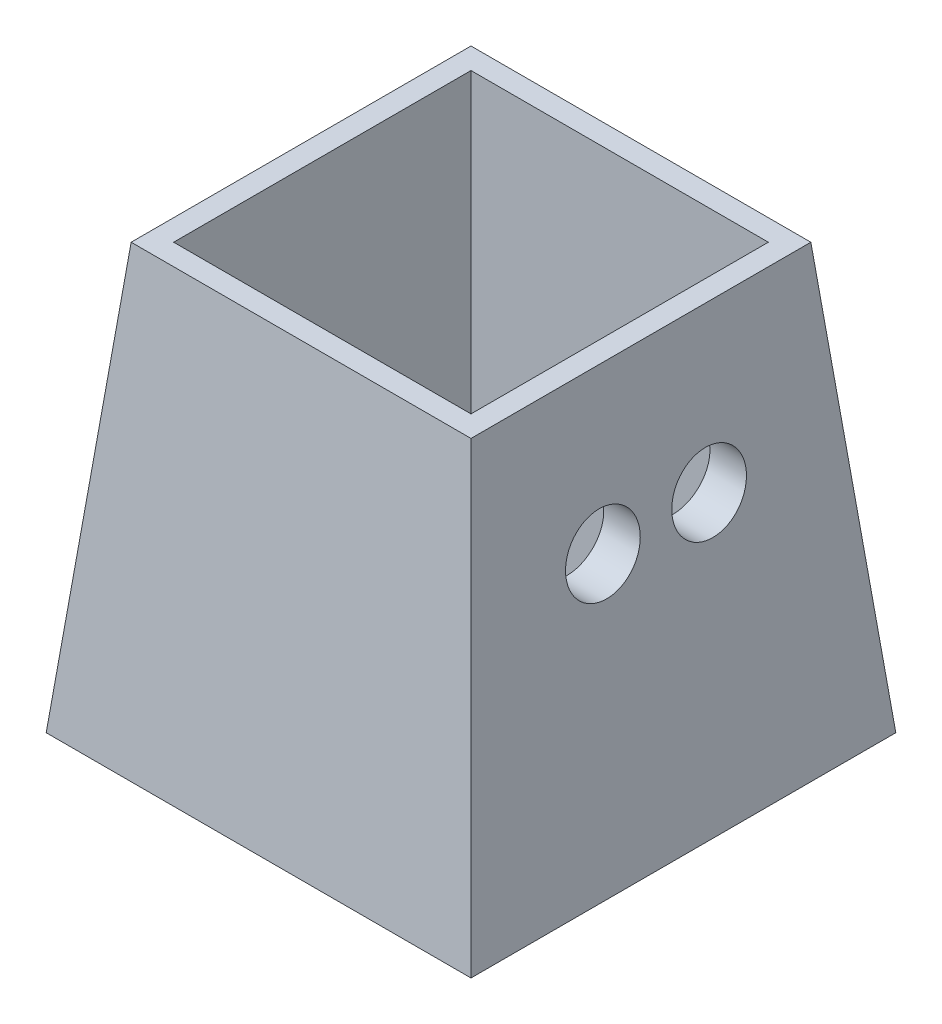
ISO-10303-21;
HEADER;
FILE_DESCRIPTION(('STEP AP214'),'2;1');
FILE_NAME('part.step','',(''),(''),'','','');
FILE_SCHEMA(('AUTOMOTIVE_DESIGN { 1 0 10303 214 1 1 1 1 }'));
ENDSEC;
DATA;
#1=APPLICATION_CONTEXT('core data for automotive mechanical design processes');
#2=APPLICATION_PROTOCOL_DEFINITION('international standard','automotive_design',2000,#1);
#3=PRODUCT_CONTEXT('',#1,'mechanical');
#4=PRODUCT('Part','Part','',(#3));
#5=PRODUCT_RELATED_PRODUCT_CATEGORY('part','',(#4));
#6=PRODUCT_DEFINITION_FORMATION('','',#4);
#7=PRODUCT_DEFINITION_CONTEXT('part definition',#1,'design');
#8=PRODUCT_DEFINITION('design','',#6,#7);
#9=PRODUCT_DEFINITION_SHAPE('','',#8);
#10=(LENGTH_UNIT() NAMED_UNIT(*) SI_UNIT(.MILLI.,.METRE.));
#11=(NAMED_UNIT(*) PLANE_ANGLE_UNIT() SI_UNIT($,.RADIAN.));
#12=(NAMED_UNIT(*) SI_UNIT($,.STERADIAN.) SOLID_ANGLE_UNIT());
#13=UNCERTAINTY_MEASURE_WITH_UNIT(LENGTH_MEASURE(1.E-05),#10,'distance_accuracy_value','');
#14=(GEOMETRIC_REPRESENTATION_CONTEXT(3) GLOBAL_UNCERTAINTY_ASSIGNED_CONTEXT((#13)) GLOBAL_UNIT_ASSIGNED_CONTEXT((#10,
#11,#12)) REPRESENTATION_CONTEXT('',''));
#15=CARTESIAN_POINT('',(0.,0.,0.));
#16=DIRECTION('',(0.,0.,1.));
#17=DIRECTION('',(1.,0.,0.));
#18=AXIS2_PLACEMENT_3D('',#15,#16,#17);
#19=CARTESIAN_POINT('',(-35.,0.,10.));
#20=DIRECTION('',(0.,0.,-1.));
#21=DIRECTION('',(-1.,0.,0.));
#22=AXIS2_PLACEMENT_3D('',#19,#20,#21);
#23=PLANE('',#22);
#24=DIRECTION('',(1.,0.,0.));
#25=VECTOR('',#24,1.);
#26=CARTESIAN_POINT('',(35.,10.,9.99999999999999));
#27=LINE('',#26,#25);
#28=CARTESIAN_POINT('',(-35.,10.,9.99999999999999));
#29=VERTEX_POINT('',#28);
#30=CARTESIAN_POINT('',(35.,10.,9.99999999999999));
#31=VERTEX_POINT('',#30);
#32=EDGE_CURVE('E145',#29,#31,#27,.T.);
#33=ORIENTED_EDGE('',*,*,#32,.F.);
#34=DIRECTION('',(0.,1.,0.));
#35=VECTOR('',#34,1.);
#36=CARTESIAN_POINT('',(-35.,0.,10.));
#37=LINE('',#36,#35);
#38=CARTESIAN_POINT('',(-35.,0.,10.));
#39=VERTEX_POINT('',#38);
#40=EDGE_CURVE('E143',#39,#29,#37,.T.);
#41=ORIENTED_EDGE('',*,*,#40,.F.);
#42=DIRECTION('',(-1.,0.,0.));
#43=VECTOR('',#42,1.);
#44=CARTESIAN_POINT('',(-35.,0.,10.));
#45=LINE('',#44,#43);
#46=CARTESIAN_POINT('',(35.,0.,9.99999999999999));
#47=VERTEX_POINT('',#46);
#48=EDGE_CURVE('E174',#47,#39,#45,.T.);
#49=ORIENTED_EDGE('',*,*,#48,.F.);
#50=DIRECTION('',(0.,1.,0.));
#51=VECTOR('',#50,1.);
#52=CARTESIAN_POINT('',(35.,0.,9.99999999999999));
#53=LINE('',#52,#51);
#54=EDGE_CURVE('E187',#47,#31,#53,.T.);
#55=ORIENTED_EDGE('',*,*,#54,.T.);
#56=EDGE_LOOP('',(#33,#41,#49,#55));
#57=FACE_BOUND('',#56,.T.);
#58=ADVANCED_FACE('F45',(#57),#23,.F.);
#59=CARTESIAN_POINT('',(-35.,0.,-9.99999999999999));
#60=DIRECTION('',(0.,0.,1.));
#61=DIRECTION('',(1.,0.,0.));
#62=AXIS2_PLACEMENT_3D('',#59,#60,#61);
#63=PLANE('',#62);
#64=DIRECTION('',(-1.,0.,0.));
#65=VECTOR('',#64,1.);
#66=CARTESIAN_POINT('',(35.,10.,-9.99999999999999));
#67=LINE('',#66,#65);
#68=CARTESIAN_POINT('',(35.,10.,-9.99999999999999));
#69=VERTEX_POINT('',#68);
#70=CARTESIAN_POINT('',(-35.,10.,-9.99999999999999));
#71=VERTEX_POINT('',#70);
#72=EDGE_CURVE('E146',#69,#71,#67,.T.);
#73=ORIENTED_EDGE('',*,*,#72,.F.);
#74=DIRECTION('',(0.,1.,0.));
#75=VECTOR('',#74,1.);
#76=CARTESIAN_POINT('',(35.,0.,-9.99999999999999));
#77=LINE('',#76,#75);
#78=CARTESIAN_POINT('',(35.,0.,-9.99999999999999));
#79=VERTEX_POINT('',#78);
#80=EDGE_CURVE('E157',#79,#69,#77,.T.);
#81=ORIENTED_EDGE('',*,*,#80,.F.);
#82=DIRECTION('',(1.,0.,0.));
#83=VECTOR('',#82,1.);
#84=CARTESIAN_POINT('',(-35.,0.,-9.99999999999999));
#85=LINE('',#84,#83);
#86=CARTESIAN_POINT('',(-35.,0.,-9.99999999999999));
#87=VERTEX_POINT('',#86);
#88=EDGE_CURVE('E155',#87,#79,#85,.T.);
#89=ORIENTED_EDGE('',*,*,#88,.F.);
#90=DIRECTION('',(0.,1.,0.));
#91=VECTOR('',#90,1.);
#92=CARTESIAN_POINT('',(-35.,0.,-9.99999999999999));
#93=LINE('',#92,#91);
#94=EDGE_CURVE('E140',#87,#71,#93,.T.);
#95=ORIENTED_EDGE('',*,*,#94,.T.);
#96=EDGE_LOOP('',(#73,#81,#89,#95));
#97=FACE_BOUND('',#96,.T.);
#98=ADVANCED_FACE('F153',(#97),#63,.F.);
#99=CARTESIAN_POINT('',(50.,0.,50.));
#100=DIRECTION('',(0.995037190209989,0.0995037190209989,0.));
#101=DIRECTION('',(0.,0.,-1.));
#102=AXIS2_PLACEMENT_3D('',#99,#100,#101);
#103=PLANE('',#102);
#104=CARTESIAN_POINT('',(43.55,64.5,12.5));
#105=DIRECTION('',(0.995037190209989,0.0995037190209989,0.));
#106=DIRECTION('',(-0.0995037190209989,0.995037190209989,0.));
#107=AXIS2_PLACEMENT_3D('',#104,#105,#106);
#108=ELLIPSE('',#107,8.79364116848078,8.75000000000001);
#109=CARTESIAN_POINT('',(42.675,73.25,12.5));
#110=VERTEX_POINT('',#109);
#111=EDGE_CURVE('E321',#110,#110,#108,.T.);
#112=ORIENTED_EDGE('',*,*,#111,.F.);
#113=EDGE_LOOP('',(#112));
#114=FACE_BOUND('',#113,.T.);
#115=CARTESIAN_POINT('',(43.55,64.5,-12.5));
#116=DIRECTION('',(0.995037190209989,0.0995037190209989,0.));
#117=DIRECTION('',(-0.0995037190209989,0.995037190209989,0.));
#118=AXIS2_PLACEMENT_3D('',#115,#116,#117);
#119=ELLIPSE('',#118,8.79364116848078,8.75);
#120=CARTESIAN_POINT('',(42.675,73.25,-12.5));
#121=VERTEX_POINT('',#120);
#122=EDGE_CURVE('E325',#121,#121,#119,.T.);
#123=ORIENTED_EDGE('',*,*,#122,.F.);
#124=EDGE_LOOP('',(#123));
#125=FACE_BOUND('',#124,.T.);
#126=DIRECTION('',(-0.0990147542976674,0.990147542976675,-0.0990147542976674));
#127=VECTOR('',#126,1.);
#128=CARTESIAN_POINT('',(50.,0.,50.));
#129=LINE('',#128,#127);
#130=CARTESIAN_POINT('',(50.,0.,50.));
#131=VERTEX_POINT('',#130);
#132=CARTESIAN_POINT('',(40.,100.,40.));
#133=VERTEX_POINT('',#132);
#134=EDGE_CURVE('E13',#131,#133,#129,.T.);
#135=ORIENTED_EDGE('',*,*,#134,.F.);
#136=DIRECTION('',(0.,0.,-1.));
#137=VECTOR('',#136,1.);
#138=CARTESIAN_POINT('',(50.,0.,50.));
#139=LINE('',#138,#137);
#140=CARTESIAN_POINT('',(50.,0.,-50.));
#141=VERTEX_POINT('',#140);
#142=EDGE_CURVE('E199',#131,#141,#139,.T.);
#143=ORIENTED_EDGE('',*,*,#142,.T.);
#144=DIRECTION('',(-0.0990147542976674,0.990147542976674,0.0990147542976674));
#145=VECTOR('',#144,1.);
#146=CARTESIAN_POINT('',(49.0196078431373,9.80392156862746,-49.0196078431373));
#147=LINE('',#146,#145);
#148=CARTESIAN_POINT('',(40.,100.,-40.));
#149=VERTEX_POINT('',#148);
#150=EDGE_CURVE('E54',#141,#149,#147,.T.);
#151=ORIENTED_EDGE('',*,*,#150,.T.);
#152=DIRECTION('',(0.,0.,-1.));
#153=VECTOR('',#152,1.);
#154=CARTESIAN_POINT('',(40.,100.,-40.));
#155=LINE('',#154,#153);
#156=EDGE_CURVE('E205',#133,#149,#155,.T.);
#157=ORIENTED_EDGE('',*,*,#156,.F.);
#158=EDGE_LOOP('',(#135,#143,#151,#157));
#159=FACE_BOUND('',#158,.T.);
#160=ADVANCED_FACE('F48',(#114,#125,#159),#103,.T.);
#161=CARTESIAN_POINT('',(50.,0.,-50.));
#162=DIRECTION('',(0.,0.0995037190209989,-0.995037190209989));
#163=DIRECTION('',(-1.,0.,0.));
#164=AXIS2_PLACEMENT_3D('',#161,#162,#163);
#165=PLANE('',#164);
#166=ORIENTED_EDGE('',*,*,#150,.F.);
#167=DIRECTION('',(-1.,0.,0.));
#168=VECTOR('',#167,1.);
#169=CARTESIAN_POINT('',(50.,0.,-50.));
#170=LINE('',#169,#168);
#171=CARTESIAN_POINT('',(-50.,0.,-50.));
#172=VERTEX_POINT('',#171);
#173=EDGE_CURVE('E202',#141,#172,#170,.T.);
#174=ORIENTED_EDGE('',*,*,#173,.T.);
#175=DIRECTION('',(0.0990147542976674,0.990147542976675,0.0990147542976674));
#176=VECTOR('',#175,1.);
#177=CARTESIAN_POINT('',(-49.0196078431373,9.80392156862746,-49.0196078431373));
#178=LINE('',#177,#176);
#179=CARTESIAN_POINT('',(-40.,100.,-40.));
#180=VERTEX_POINT('',#179);
#181=EDGE_CURVE('E219',#172,#180,#178,.T.);
#182=ORIENTED_EDGE('',*,*,#181,.T.);
#183=DIRECTION('',(-1.,0.,0.));
#184=VECTOR('',#183,1.);
#185=CARTESIAN_POINT('',(-40.,100.,-40.));
#186=LINE('',#185,#184);
#187=EDGE_CURVE('E208',#149,#180,#186,.T.);
#188=ORIENTED_EDGE('',*,*,#187,.F.);
#189=EDGE_LOOP('',(#166,#174,#182,#188));
#190=FACE_BOUND('',#189,.T.);
#191=ADVANCED_FACE('F226',(#190),#165,.T.);
#192=CARTESIAN_POINT('',(-50.,0.,50.));
#193=DIRECTION('',(-0.995037190209989,0.0995037190209989,0.));
#194=DIRECTION('',(0.,0.,1.));
#195=AXIS2_PLACEMENT_3D('',#192,#193,#194);
#196=PLANE('',#195);
#197=ORIENTED_EDGE('',*,*,#181,.F.);
#198=DIRECTION('',(0.,0.,1.));
#199=VECTOR('',#198,1.);
#200=CARTESIAN_POINT('',(-50.,0.,50.));
#201=LINE('',#200,#199);
#202=CARTESIAN_POINT('',(-50.,0.,50.));
#203=VERTEX_POINT('',#202);
#204=EDGE_CURVE('E192',#172,#203,#201,.T.);
#205=ORIENTED_EDGE('',*,*,#204,.T.);
#206=DIRECTION('',(0.0990147542976674,0.990147542976674,-0.0990147542976674));
#207=VECTOR('',#206,1.);
#208=CARTESIAN_POINT('',(-50.,0.,50.));
#209=LINE('',#208,#207);
#210=CARTESIAN_POINT('',(-40.,100.,40.));
#211=VERTEX_POINT('',#210);
#212=EDGE_CURVE('E217',#203,#211,#209,.T.);
#213=ORIENTED_EDGE('',*,*,#212,.T.);
#214=DIRECTION('',(0.,0.,1.));
#215=VECTOR('',#214,1.);
#216=CARTESIAN_POINT('',(-40.,100.,40.));
#217=LINE('',#216,#215);
#218=EDGE_CURVE('E211',#180,#211,#217,.T.);
#219=ORIENTED_EDGE('',*,*,#218,.F.);
#220=EDGE_LOOP('',(#197,#205,#213,#219));
#221=FACE_BOUND('',#220,.T.);
#222=ADVANCED_FACE('F238',(#221),#196,.T.);
#223=CARTESIAN_POINT('',(50.,0.,50.));
#224=DIRECTION('',(0.,0.0995037190209989,0.995037190209989));
#225=DIRECTION('',(1.,0.,0.));
#226=AXIS2_PLACEMENT_3D('',#223,#224,#225);
#227=PLANE('',#226);
#228=DIRECTION('',(1.,0.,0.));
#229=VECTOR('',#228,1.);
#230=CARTESIAN_POINT('',(50.,0.,50.));
#231=LINE('',#230,#229);
#232=EDGE_CURVE('E195',#203,#131,#231,.T.);
#233=ORIENTED_EDGE('',*,*,#232,.T.);
#234=ORIENTED_EDGE('',*,*,#134,.T.);
#235=DIRECTION('',(1.,0.,0.));
#236=VECTOR('',#235,1.);
#237=CARTESIAN_POINT('',(40.,100.,40.));
#238=LINE('',#237,#236);
#239=EDGE_CURVE('E214',#211,#133,#238,.T.);
#240=ORIENTED_EDGE('',*,*,#239,.F.);
#241=ORIENTED_EDGE('',*,*,#212,.F.);
#242=EDGE_LOOP('',(#233,#234,#240,#241));
#243=FACE_BOUND('',#242,.T.);
#244=ADVANCED_FACE('F232',(#243),#227,.T.);
#245=CARTESIAN_POINT('',(0.,100.,0.));
#246=DIRECTION('',(0.,1.,0.));
#247=DIRECTION('',(0.,0.,1.));
#248=AXIS2_PLACEMENT_3D('',#245,#246,#247);
#249=PLANE('',#248);
#250=DIRECTION('',(0.,0.,-1.));
#251=VECTOR('',#250,1.);
#252=CARTESIAN_POINT('',(35.,100.,-35.));
#253=LINE('',#252,#251);
#254=CARTESIAN_POINT('',(35.,100.,35.));
#255=VERTEX_POINT('',#254);
#256=CARTESIAN_POINT('',(35.,100.,-35.));
#257=VERTEX_POINT('',#256);
#258=EDGE_CURVE('E69',#255,#257,#253,.T.);
#259=ORIENTED_EDGE('',*,*,#258,.F.);
#260=DIRECTION('',(1.,0.,0.));
#261=VECTOR('',#260,1.);
#262=CARTESIAN_POINT('',(-35.,100.,35.));
#263=LINE('',#262,#261);
#264=CARTESIAN_POINT('',(-35.,100.,35.));
#265=VERTEX_POINT('',#264);
#266=EDGE_CURVE('E171',#265,#255,#263,.T.);
#267=ORIENTED_EDGE('',*,*,#266,.F.);
#268=DIRECTION('',(0.,0.,1.));
#269=VECTOR('',#268,1.);
#270=CARTESIAN_POINT('',(-35.,100.,-35.));
#271=LINE('',#270,#269);
#272=CARTESIAN_POINT('',(-35.,100.,-35.));
#273=VERTEX_POINT('',#272);
#274=EDGE_CURVE('E185',#273,#265,#271,.T.);
#275=ORIENTED_EDGE('',*,*,#274,.F.);
#276=DIRECTION('',(-1.,0.,0.));
#277=VECTOR('',#276,1.);
#278=CARTESIAN_POINT('',(-35.,100.,-35.));
#279=LINE('',#278,#277);
#280=EDGE_CURVE('E289',#257,#273,#279,.T.);
#281=ORIENTED_EDGE('',*,*,#280,.F.);
#282=EDGE_LOOP('',(#259,#267,#275,#281));
#283=FACE_BOUND('',#282,.T.);
#284=ORIENTED_EDGE('',*,*,#218,.T.);
#285=ORIENTED_EDGE('',*,*,#239,.T.);
#286=ORIENTED_EDGE('',*,*,#156,.T.);
#287=ORIENTED_EDGE('',*,*,#187,.T.);
#288=EDGE_LOOP('',(#284,#285,#286,#287));
#289=FACE_BOUND('',#288,.T.);
#290=ADVANCED_FACE('F229',(#283,#289),#249,.T.);
#291=CARTESIAN_POINT('',(0.,0.,0.));
#292=DIRECTION('',(0.,1.,0.));
#293=DIRECTION('',(0.,0.,1.));
#294=AXIS2_PLACEMENT_3D('',#291,#292,#293);
#295=PLANE('',#294);
#296=DIRECTION('',(-1.,0.,0.));
#297=VECTOR('',#296,1.);
#298=CARTESIAN_POINT('',(-35.,0.,-35.));
#299=LINE('',#298,#297);
#300=CARTESIAN_POINT('',(35.,0.,-35.));
#301=VERTEX_POINT('',#300);
#302=CARTESIAN_POINT('',(-35.,0.,-35.));
#303=VERTEX_POINT('',#302);
#304=EDGE_CURVE('E158',#301,#303,#299,.T.);
#305=ORIENTED_EDGE('',*,*,#304,.T.);
#306=DIRECTION('',(0.,0.,1.));
#307=VECTOR('',#306,1.);
#308=CARTESIAN_POINT('',(-35.,0.,-35.));
#309=LINE('',#308,#307);
#310=EDGE_CURVE('E287',#303,#87,#309,.T.);
#311=ORIENTED_EDGE('',*,*,#310,.T.);
#312=ORIENTED_EDGE('',*,*,#88,.T.);
#313=DIRECTION('',(0.,0.,-1.));
#314=VECTOR('',#313,1.);
#315=CARTESIAN_POINT('',(35.,0.,-35.));
#316=LINE('',#315,#314);
#317=EDGE_CURVE('E163',#79,#301,#316,.T.);
#318=ORIENTED_EDGE('',*,*,#317,.T.);
#319=EDGE_LOOP('',(#305,#311,#312,#318));
#320=FACE_BOUND('',#319,.T.);
#321=DIRECTION('',(0.,0.,1.));
#322=VECTOR('',#321,1.);
#323=CARTESIAN_POINT('',(-35.,0.,35.));
#324=LINE('',#323,#322);
#325=CARTESIAN_POINT('',(-35.,0.,35.));
#326=VERTEX_POINT('',#325);
#327=EDGE_CURVE('E177',#39,#326,#324,.T.);
#328=ORIENTED_EDGE('',*,*,#327,.T.);
#329=DIRECTION('',(1.,0.,0.));
#330=VECTOR('',#329,1.);
#331=CARTESIAN_POINT('',(-35.,0.,35.));
#332=LINE('',#331,#330);
#333=CARTESIAN_POINT('',(35.,0.,35.));
#334=VERTEX_POINT('',#333);
#335=EDGE_CURVE('E167',#326,#334,#332,.T.);
#336=ORIENTED_EDGE('',*,*,#335,.T.);
#337=DIRECTION('',(0.,0.,-1.));
#338=VECTOR('',#337,1.);
#339=CARTESIAN_POINT('',(35.,0.,35.));
#340=LINE('',#339,#338);
#341=EDGE_CURVE('E170',#334,#47,#340,.T.);
#342=ORIENTED_EDGE('',*,*,#341,.T.);
#343=ORIENTED_EDGE('',*,*,#48,.T.);
#344=EDGE_LOOP('',(#328,#336,#342,#343));
#345=FACE_BOUND('',#344,.T.);
#346=ORIENTED_EDGE('',*,*,#204,.F.);
#347=ORIENTED_EDGE('',*,*,#173,.F.);
#348=ORIENTED_EDGE('',*,*,#142,.F.);
#349=ORIENTED_EDGE('',*,*,#232,.F.);
#350=EDGE_LOOP('',(#346,#347,#348,#349));
#351=FACE_BOUND('',#350,.T.);
#352=ADVANCED_FACE('F236',(#320,#345,#351),#295,.F.);
#353=CARTESIAN_POINT('',(-35.,0.,35.));
#354=DIRECTION('',(0.,0.,1.));
#355=DIRECTION('',(1.,0.,0.));
#356=AXIS2_PLACEMENT_3D('',#353,#354,#355);
#357=PLANE('',#356);
#358=ORIENTED_EDGE('',*,*,#266,.T.);
#359=DIRECTION('',(0.,1.,0.));
#360=VECTOR('',#359,1.);
#361=CARTESIAN_POINT('',(35.,0.,35.));
#362=LINE('',#361,#360);
#363=EDGE_CURVE('E180',#334,#255,#362,.T.);
#364=ORIENTED_EDGE('',*,*,#363,.F.);
#365=ORIENTED_EDGE('',*,*,#335,.F.);
#366=DIRECTION('',(0.,1.,0.));
#367=VECTOR('',#366,1.);
#368=CARTESIAN_POINT('',(-35.,0.,35.));
#369=LINE('',#368,#367);
#370=EDGE_CURVE('E182',#326,#265,#369,.T.);
#371=ORIENTED_EDGE('',*,*,#370,.T.);
#372=EDGE_LOOP('',(#358,#364,#365,#371));
#373=FACE_BOUND('',#372,.T.);
#374=ADVANCED_FACE('F256',(#373),#357,.F.);
#375=CARTESIAN_POINT('',(-35.,0.,-35.));
#376=DIRECTION('',(-1.,0.,0.));
#377=DIRECTION('',(0.,0.,1.));
#378=AXIS2_PLACEMENT_3D('',#375,#376,#377);
#379=PLANE('',#378);
#380=ORIENTED_EDGE('',*,*,#274,.T.);
#381=ORIENTED_EDGE('',*,*,#370,.F.);
#382=ORIENTED_EDGE('',*,*,#327,.F.);
#383=ORIENTED_EDGE('',*,*,#40,.T.);
#384=DIRECTION('',(0.,0.,1.));
#385=VECTOR('',#384,1.);
#386=CARTESIAN_POINT('',(-35.,10.,9.99999999999999));
#387=LINE('',#386,#385);
#388=EDGE_CURVE('E136',#71,#29,#387,.T.);
#389=ORIENTED_EDGE('',*,*,#388,.F.);
#390=ORIENTED_EDGE('',*,*,#94,.F.);
#391=ORIENTED_EDGE('',*,*,#310,.F.);
#392=DIRECTION('',(0.,1.,0.));
#393=VECTOR('',#392,1.);
#394=CARTESIAN_POINT('',(-35.,0.,-35.));
#395=LINE('',#394,#393);
#396=EDGE_CURVE('E196',#303,#273,#395,.T.);
#397=ORIENTED_EDGE('',*,*,#396,.T.);
#398=EDGE_LOOP('',(#380,#381,#382,#383,#389,#390,#391,#397));
#399=FACE_BOUND('',#398,.T.);
#400=ADVANCED_FACE('F137',(#399),#379,.F.);
#401=CARTESIAN_POINT('',(-35.,0.,-35.));
#402=DIRECTION('',(0.,0.,-1.));
#403=DIRECTION('',(-1.,0.,0.));
#404=AXIS2_PLACEMENT_3D('',#401,#402,#403);
#405=PLANE('',#404);
#406=ORIENTED_EDGE('',*,*,#280,.T.);
#407=ORIENTED_EDGE('',*,*,#396,.F.);
#408=ORIENTED_EDGE('',*,*,#304,.F.);
#409=DIRECTION('',(0.,1.,0.));
#410=VECTOR('',#409,1.);
#411=CARTESIAN_POINT('',(35.,0.,-35.));
#412=LINE('',#411,#410);
#413=EDGE_CURVE('E160',#301,#257,#412,.T.);
#414=ORIENTED_EDGE('',*,*,#413,.T.);
#415=EDGE_LOOP('',(#406,#407,#408,#414));
#416=FACE_BOUND('',#415,.T.);
#417=ADVANCED_FACE('F297',(#416),#405,.F.);
#418=CARTESIAN_POINT('',(35.,0.,-35.));
#419=DIRECTION('',(1.,0.,0.));
#420=DIRECTION('',(0.,0.,-1.));
#421=AXIS2_PLACEMENT_3D('',#418,#419,#420);
#422=PLANE('',#421);
#423=CARTESIAN_POINT('',(35.,64.5,12.5));
#424=DIRECTION('',(-1.,0.,0.));
#425=DIRECTION('',(0.,0.,1.));
#426=AXIS2_PLACEMENT_3D('',#423,#424,#425);
#427=CIRCLE('',#426,8.75000000000001);
#428=CARTESIAN_POINT('',(35.,64.5,21.25));
#429=VERTEX_POINT('',#428);
#430=EDGE_CURVE('E324',#429,#429,#427,.T.);
#431=ORIENTED_EDGE('',*,*,#430,.F.);
#432=EDGE_LOOP('',(#431));
#433=FACE_BOUND('',#432,.T.);
#434=CARTESIAN_POINT('',(35.,64.5,-12.5));
#435=DIRECTION('',(-1.,0.,0.));
#436=DIRECTION('',(0.,0.,1.));
#437=AXIS2_PLACEMENT_3D('',#434,#435,#436);
#438=CIRCLE('',#437,8.75);
#439=CARTESIAN_POINT('',(35.,64.5,-3.74999999999999));
#440=VERTEX_POINT('',#439);
#441=EDGE_CURVE('E326',#440,#440,#438,.T.);
#442=ORIENTED_EDGE('',*,*,#441,.F.);
#443=EDGE_LOOP('',(#442));
#444=FACE_BOUND('',#443,.T.);
#445=ORIENTED_EDGE('',*,*,#258,.T.);
#446=ORIENTED_EDGE('',*,*,#413,.F.);
#447=ORIENTED_EDGE('',*,*,#317,.F.);
#448=ORIENTED_EDGE('',*,*,#80,.T.);
#449=DIRECTION('',(0.,0.,-1.));
#450=VECTOR('',#449,1.);
#451=CARTESIAN_POINT('',(35.,10.,9.99999999999999));
#452=LINE('',#451,#450);
#453=EDGE_CURVE('E61',#31,#69,#452,.T.);
#454=ORIENTED_EDGE('',*,*,#453,.F.);
#455=ORIENTED_EDGE('',*,*,#54,.F.);
#456=ORIENTED_EDGE('',*,*,#341,.F.);
#457=ORIENTED_EDGE('',*,*,#363,.T.);
#458=EDGE_LOOP('',(#445,#446,#447,#448,#454,#455,#456,#457));
#459=FACE_BOUND('',#458,.T.);
#460=ADVANCED_FACE('F284',(#433,#444,#459),#422,.F.);
#461=CARTESIAN_POINT('',(0.,10.,0.));
#462=DIRECTION('',(0.,1.,0.));
#463=DIRECTION('',(0.,0.,1.));
#464=AXIS2_PLACEMENT_3D('',#461,#462,#463);
#465=PLANE('',#464);
#466=ORIENTED_EDGE('',*,*,#453,.T.);
#467=ORIENTED_EDGE('',*,*,#72,.T.);
#468=ORIENTED_EDGE('',*,*,#388,.T.);
#469=ORIENTED_EDGE('',*,*,#32,.T.);
#470=EDGE_LOOP('',(#466,#467,#468,#469));
#471=FACE_BOUND('',#470,.T.);
#472=ADVANCED_FACE('F148',(#471),#465,.T.);
#473=CARTESIAN_POINT('',(50.,64.5,-12.5));
#474=DIRECTION('',(-1.,0.,0.));
#475=DIRECTION('',(0.,0.,1.));
#476=AXIS2_PLACEMENT_3D('',#473,#474,#475);
#477=CYLINDRICAL_SURFACE('',#476,8.75);
#478=ORIENTED_EDGE('',*,*,#122,.T.);
#479=EDGE_LOOP('',(#478));
#480=FACE_BOUND('',#479,.T.);
#481=ORIENTED_EDGE('',*,*,#441,.T.);
#482=EDGE_LOOP('',(#481));
#483=FACE_BOUND('',#482,.T.);
#484=ADVANCED_FACE('F309',(#480,#483),#477,.F.);
#485=CARTESIAN_POINT('',(50.,64.5,12.5));
#486=DIRECTION('',(-1.,0.,0.));
#487=DIRECTION('',(0.,0.,1.));
#488=AXIS2_PLACEMENT_3D('',#485,#486,#487);
#489=CYLINDRICAL_SURFACE('',#488,8.75000000000001);
#490=ORIENTED_EDGE('',*,*,#111,.T.);
#491=EDGE_LOOP('',(#490));
#492=FACE_BOUND('',#491,.T.);
#493=ORIENTED_EDGE('',*,*,#430,.T.);
#494=EDGE_LOOP('',(#493));
#495=FACE_BOUND('',#494,.T.);
#496=ADVANCED_FACE('F312',(#492,#495),#489,.F.);
#497=CLOSED_SHELL('',(#58,#98,#160,#191,#222,#244,#290,#352,#374,#400,#417,#460,#472,#484,#496));
#498=MANIFOLD_SOLID_BREP('B2',#497);
#499=ADVANCED_BREP_SHAPE_REPRESENTATION('',(#18,#498),#14);
#500=SHAPE_DEFINITION_REPRESENTATION(#9,#499);
ENDSEC;
END-ISO-10303-21;
